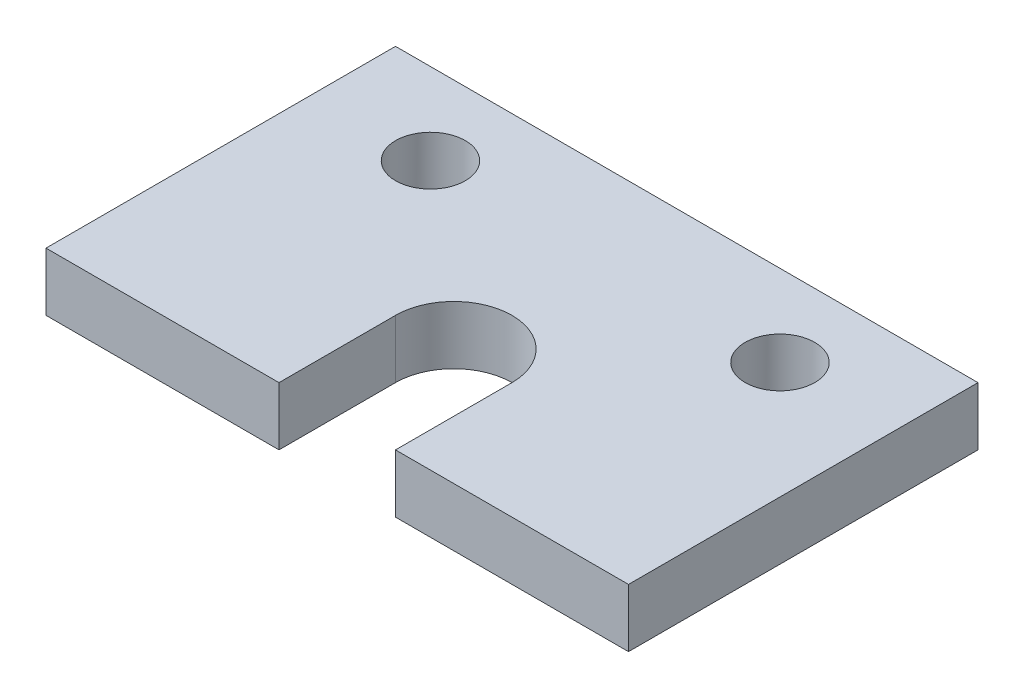
ISO-10303-21;
HEADER;
FILE_DESCRIPTION(('STEP AP214'),'2;1');
FILE_NAME('part.step','',(''),(''),'','','');
FILE_SCHEMA(('AUTOMOTIVE_DESIGN { 1 0 10303 214 1 1 1 1 }'));
ENDSEC;
DATA;
#1=APPLICATION_CONTEXT('core data for automotive mechanical design processes');
#2=APPLICATION_PROTOCOL_DEFINITION('international standard','automotive_design',2000,#1);
#3=PRODUCT_CONTEXT('',#1,'mechanical');
#4=PRODUCT('Part','Part','',(#3));
#5=PRODUCT_RELATED_PRODUCT_CATEGORY('part','',(#4));
#6=PRODUCT_DEFINITION_FORMATION('','',#4);
#7=PRODUCT_DEFINITION_CONTEXT('part definition',#1,'design');
#8=PRODUCT_DEFINITION('design','',#6,#7);
#9=PRODUCT_DEFINITION_SHAPE('','',#8);
#10=(LENGTH_UNIT() NAMED_UNIT(*) SI_UNIT(.MILLI.,.METRE.));
#11=(NAMED_UNIT(*) PLANE_ANGLE_UNIT() SI_UNIT($,.RADIAN.));
#12=(NAMED_UNIT(*) SI_UNIT($,.STERADIAN.) SOLID_ANGLE_UNIT());
#13=UNCERTAINTY_MEASURE_WITH_UNIT(LENGTH_MEASURE(1.E-05),#10,'distance_accuracy_value','');
#14=(GEOMETRIC_REPRESENTATION_CONTEXT(3) GLOBAL_UNCERTAINTY_ASSIGNED_CONTEXT((#13)) GLOBAL_UNIT_ASSIGNED_CONTEXT((#10,
#11,#12)) REPRESENTATION_CONTEXT('',''));
#15=CARTESIAN_POINT('',(0.,0.,0.));
#16=DIRECTION('',(0.,0.,1.));
#17=DIRECTION('',(1.,0.,0.));
#18=AXIS2_PLACEMENT_3D('',#15,#16,#17);
#19=CARTESIAN_POINT('',(-15.875,3.175,9.52500000000001));
#20=DIRECTION('',(0.,0.,-0.999999999999999));
#21=DIRECTION('',(-0.999999999999999,0.,0.));
#22=AXIS2_PLACEMENT_3D('',#19,#20,#21);
#23=PLANE('',#22);
#24=DIRECTION('',(0.999999999999999,0.,0.));
#25=VECTOR('',#24,1.);
#26=CARTESIAN_POINT('',(-15.875,3.175,9.52500000000001));
#27=LINE('',#26,#25);
#28=CARTESIAN_POINT('',(3.17499999999999,3.175,9.52499999999995));
#29=VERTEX_POINT('',#28);
#30=CARTESIAN_POINT('',(15.875,3.175,9.52500000000001));
#31=VERTEX_POINT('',#30);
#32=EDGE_CURVE('E66',#29,#31,#27,.T.);
#33=ORIENTED_EDGE('',*,*,#32,.F.);
#34=DIRECTION('',(0.,1.,0.));
#35=VECTOR('',#34,1.);
#36=CARTESIAN_POINT('',(3.17499999999999,0.,9.52499999999995));
#37=LINE('',#36,#35);
#38=CARTESIAN_POINT('',(3.17499999999999,0.,9.52499999999995));
#39=VERTEX_POINT('',#38);
#40=EDGE_CURVE('E158',#39,#29,#37,.T.);
#41=ORIENTED_EDGE('',*,*,#40,.F.);
#42=DIRECTION('',(0.999999999999999,0.,0.));
#43=VECTOR('',#42,1.);
#44=CARTESIAN_POINT('',(-15.875,0.,9.52500000000001));
#45=LINE('',#44,#43);
#46=CARTESIAN_POINT('',(15.875,0.,9.52500000000001));
#47=VERTEX_POINT('',#46);
#48=EDGE_CURVE('E88',#39,#47,#45,.T.);
#49=ORIENTED_EDGE('',*,*,#48,.T.);
#50=DIRECTION('',(0.,-1.,0.));
#51=VECTOR('',#50,1.);
#52=CARTESIAN_POINT('',(15.875,3.175,9.52500000000001));
#53=LINE('',#52,#51);
#54=EDGE_CURVE('E176',#31,#47,#53,.T.);
#55=ORIENTED_EDGE('',*,*,#54,.F.);
#56=EDGE_LOOP('',(#33,#41,#49,#55));
#57=FACE_BOUND('',#56,.T.);
#58=ADVANCED_FACE('F41',(#57),#23,.F.);
#59=CARTESIAN_POINT('',(15.875,3.175,9.52500000000001));
#60=DIRECTION('',(-0.999999999999999,0.,0.));
#61=DIRECTION('',(0.,0.,0.999999999999999));
#62=AXIS2_PLACEMENT_3D('',#59,#60,#61);
#63=PLANE('',#62);
#64=DIRECTION('',(0.,0.,-0.999999999999999));
#65=VECTOR('',#64,1.);
#66=CARTESIAN_POINT('',(15.875,0.,9.52500000000001));
#67=LINE('',#66,#65);
#68=CARTESIAN_POINT('',(15.875,0.,-9.52500000000001));
#69=VERTEX_POINT('',#68);
#70=EDGE_CURVE('E157',#47,#69,#67,.T.);
#71=ORIENTED_EDGE('',*,*,#70,.T.);
#72=DIRECTION('',(0.,-1.,0.));
#73=VECTOR('',#72,1.);
#74=CARTESIAN_POINT('',(15.875,3.175,-9.52500000000001));
#75=LINE('',#74,#73);
#76=CARTESIAN_POINT('',(15.875,3.175,-9.52500000000001));
#77=VERTEX_POINT('',#76);
#78=EDGE_CURVE('E11',#77,#69,#75,.T.);
#79=ORIENTED_EDGE('',*,*,#78,.F.);
#80=DIRECTION('',(0.,0.,-0.999999999999999));
#81=VECTOR('',#80,1.);
#82=CARTESIAN_POINT('',(15.875,3.175,9.52500000000001));
#83=LINE('',#82,#81);
#84=EDGE_CURVE('E163',#31,#77,#83,.T.);
#85=ORIENTED_EDGE('',*,*,#84,.F.);
#86=ORIENTED_EDGE('',*,*,#54,.T.);
#87=EDGE_LOOP('',(#71,#79,#85,#86));
#88=FACE_BOUND('',#87,.T.);
#89=ADVANCED_FACE('F43',(#88),#63,.F.);
#90=CARTESIAN_POINT('',(-15.875,3.175,-9.52500000000001));
#91=DIRECTION('',(0.,0.,0.999999999999999));
#92=DIRECTION('',(0.999999999999999,0.,0.));
#93=AXIS2_PLACEMENT_3D('',#90,#91,#92);
#94=PLANE('',#93);
#95=DIRECTION('',(-0.999999999999999,0.,0.));
#96=VECTOR('',#95,1.);
#97=CARTESIAN_POINT('',(-15.875,0.,-9.52500000000001));
#98=LINE('',#97,#96);
#99=CARTESIAN_POINT('',(-15.875,0.,-9.52500000000001));
#100=VERTEX_POINT('',#99);
#101=EDGE_CURVE('E180',#69,#100,#98,.T.);
#102=ORIENTED_EDGE('',*,*,#101,.T.);
#103=DIRECTION('',(0.,-1.,0.));
#104=VECTOR('',#103,1.);
#105=CARTESIAN_POINT('',(-15.875,3.175,-9.52500000000001));
#106=LINE('',#105,#104);
#107=CARTESIAN_POINT('',(-15.875,3.175,-9.52500000000001));
#108=VERTEX_POINT('',#107);
#109=EDGE_CURVE('E50',#108,#100,#106,.T.);
#110=ORIENTED_EDGE('',*,*,#109,.F.);
#111=DIRECTION('',(-0.999999999999999,0.,0.));
#112=VECTOR('',#111,1.);
#113=CARTESIAN_POINT('',(-15.875,3.175,-9.52500000000001));
#114=LINE('',#113,#112);
#115=EDGE_CURVE('E95',#77,#108,#114,.T.);
#116=ORIENTED_EDGE('',*,*,#115,.F.);
#117=ORIENTED_EDGE('',*,*,#78,.T.);
#118=EDGE_LOOP('',(#102,#110,#116,#117));
#119=FACE_BOUND('',#118,.T.);
#120=ADVANCED_FACE('F208',(#119),#94,.F.);
#121=CARTESIAN_POINT('',(-15.875,3.175,9.52500000000001));
#122=DIRECTION('',(0.999999999999999,0.,0.));
#123=DIRECTION('',(0.,0.,-0.999999999999999));
#124=AXIS2_PLACEMENT_3D('',#121,#122,#123);
#125=PLANE('',#124);
#126=DIRECTION('',(0.,0.,0.999999999999999));
#127=VECTOR('',#126,1.);
#128=CARTESIAN_POINT('',(-15.875,0.,9.52500000000001));
#129=LINE('',#128,#127);
#130=CARTESIAN_POINT('',(-15.875,0.,9.52500000000001));
#131=VERTEX_POINT('',#130);
#132=EDGE_CURVE('E183',#100,#131,#129,.T.);
#133=ORIENTED_EDGE('',*,*,#132,.T.);
#134=DIRECTION('',(0.,-1.,0.));
#135=VECTOR('',#134,1.);
#136=CARTESIAN_POINT('',(-15.875,3.175,9.52500000000001));
#137=LINE('',#136,#135);
#138=CARTESIAN_POINT('',(-15.875,3.175,9.52500000000001));
#139=VERTEX_POINT('',#138);
#140=EDGE_CURVE('E190',#139,#131,#137,.T.);
#141=ORIENTED_EDGE('',*,*,#140,.F.);
#142=DIRECTION('',(0.,0.,0.999999999999999));
#143=VECTOR('',#142,1.);
#144=CARTESIAN_POINT('',(-15.875,3.175,9.52500000000001));
#145=LINE('',#144,#143);
#146=EDGE_CURVE('E169',#108,#139,#145,.T.);
#147=ORIENTED_EDGE('',*,*,#146,.F.);
#148=ORIENTED_EDGE('',*,*,#109,.T.);
#149=EDGE_LOOP('',(#133,#141,#147,#148));
#150=FACE_BOUND('',#149,.T.);
#151=ADVANCED_FACE('F198',(#150),#125,.F.);
#152=CARTESIAN_POINT('',(-3.175,0.,9.52500000000001));
#153=VERTEX_POINT('',#152);
#154=EDGE_CURVE('E166',#131,#153,#45,.T.);
#155=ORIENTED_EDGE('',*,*,#154,.T.);
#156=DIRECTION('',(0.,1.,0.));
#157=VECTOR('',#156,1.);
#158=CARTESIAN_POINT('',(-3.175,0.,9.52500000000001));
#159=LINE('',#158,#157);
#160=CARTESIAN_POINT('',(-3.175,3.175,9.52500000000001));
#161=VERTEX_POINT('',#160);
#162=EDGE_CURVE('E57',#153,#161,#159,.T.);
#163=ORIENTED_EDGE('',*,*,#162,.T.);
#164=EDGE_CURVE('E172',#139,#161,#27,.T.);
#165=ORIENTED_EDGE('',*,*,#164,.F.);
#166=ORIENTED_EDGE('',*,*,#140,.T.);
#167=EDGE_LOOP('',(#155,#163,#165,#166));
#168=FACE_BOUND('',#167,.T.);
#169=ADVANCED_FACE('F202',(#168),#23,.F.);
#170=CARTESIAN_POINT('',(0.,3.175,0.));
#171=DIRECTION('',(0.,-1.,0.));
#172=DIRECTION('',(0.,0.,-0.999999999999999));
#173=AXIS2_PLACEMENT_3D('',#170,#171,#172);
#174=PLANE('',#173);
#175=CARTESIAN_POINT('',(-9.52499999999999,3.175,-5.08));
#176=DIRECTION('',(0.,1.,0.));
#177=DIRECTION('',(0.,0.,0.999999999999999));
#178=AXIS2_PLACEMENT_3D('',#175,#176,#177);
#179=CIRCLE('',#178,1.89865);
#180=CARTESIAN_POINT('',(-9.52499999999999,3.175,-3.18135));
#181=VERTEX_POINT('',#180);
#182=EDGE_CURVE('E252',#181,#181,#179,.T.);
#183=ORIENTED_EDGE('',*,*,#182,.F.);
#184=EDGE_LOOP('',(#183));
#185=FACE_BOUND('',#184,.T.);
#186=CARTESIAN_POINT('',(9.52499999999999,3.175,-5.08));
#187=DIRECTION('',(0.,1.,0.));
#188=DIRECTION('',(0.,0.,0.999999999999999));
#189=AXIS2_PLACEMENT_3D('',#186,#187,#188);
#190=CIRCLE('',#189,1.89865);
#191=CARTESIAN_POINT('',(9.52499999999999,3.175,-3.18135));
#192=VERTEX_POINT('',#191);
#193=EDGE_CURVE('E257',#192,#192,#190,.T.);
#194=ORIENTED_EDGE('',*,*,#193,.F.);
#195=EDGE_LOOP('',(#194));
#196=FACE_BOUND('',#195,.T.);
#197=CARTESIAN_POINT('',(0.,3.175,3.17500000000001));
#198=DIRECTION('',(0.,1.,0.));
#199=DIRECTION('',(0.,0.,0.999999999999999));
#200=AXIS2_PLACEMENT_3D('',#197,#198,#199);
#201=CIRCLE('',#200,3.175);
#202=CARTESIAN_POINT('',(3.17499999999999,3.175,3.17499999999998));
#203=VERTEX_POINT('',#202);
#204=CARTESIAN_POINT('',(-3.175,3.175,3.17500000000001));
#205=VERTEX_POINT('',#204);
#206=EDGE_CURVE('E124',#203,#205,#201,.T.);
#207=ORIENTED_EDGE('',*,*,#206,.F.);
#208=DIRECTION('',(0.,0.,-0.999999999999999));
#209=VECTOR('',#208,1.);
#210=CARTESIAN_POINT('',(3.17499999999999,3.175,9.52499999999995));
#211=LINE('',#210,#209);
#212=EDGE_CURVE('E138',#29,#203,#211,.T.);
#213=ORIENTED_EDGE('',*,*,#212,.F.);
#214=ORIENTED_EDGE('',*,*,#32,.T.);
#215=ORIENTED_EDGE('',*,*,#84,.T.);
#216=ORIENTED_EDGE('',*,*,#115,.T.);
#217=ORIENTED_EDGE('',*,*,#146,.T.);
#218=ORIENTED_EDGE('',*,*,#164,.T.);
#219=DIRECTION('',(0.,0.,0.999999999999999));
#220=VECTOR('',#219,1.);
#221=CARTESIAN_POINT('',(-3.175,3.175,3.17500000000001));
#222=LINE('',#221,#220);
#223=EDGE_CURVE('E142',#205,#161,#222,.T.);
#224=ORIENTED_EDGE('',*,*,#223,.F.);
#225=EDGE_LOOP('',(#207,#213,#214,#215,#216,#217,#218,#224));
#226=FACE_BOUND('',#225,.T.);
#227=ADVANCED_FACE('F204',(#185,#196,#226),#174,.F.);
#228=CARTESIAN_POINT('',(0.,0.,0.));
#229=DIRECTION('',(0.,-1.,0.));
#230=DIRECTION('',(0.,0.,-0.999999999999999));
#231=AXIS2_PLACEMENT_3D('',#228,#229,#230);
#232=PLANE('',#231);
#233=CARTESIAN_POINT('',(-9.52499999999999,0.,-5.08));
#234=DIRECTION('',(0.,-1.,0.));
#235=DIRECTION('',(0.,0.,-0.999999999999999));
#236=AXIS2_PLACEMENT_3D('',#233,#234,#235);
#237=CIRCLE('',#236,1.89865);
#238=CARTESIAN_POINT('',(-9.52499999999999,0.,-6.97865));
#239=VERTEX_POINT('',#238);
#240=EDGE_CURVE('E255',#239,#239,#237,.T.);
#241=ORIENTED_EDGE('',*,*,#240,.F.);
#242=EDGE_LOOP('',(#241));
#243=FACE_BOUND('',#242,.T.);
#244=CARTESIAN_POINT('',(9.52499999999999,0.,-5.08));
#245=DIRECTION('',(0.,-1.,0.));
#246=DIRECTION('',(0.,0.,-0.999999999999999));
#247=AXIS2_PLACEMENT_3D('',#244,#245,#246);
#248=CIRCLE('',#247,1.89865);
#249=CARTESIAN_POINT('',(9.52499999999999,0.,-6.97865));
#250=VERTEX_POINT('',#249);
#251=EDGE_CURVE('E145',#250,#250,#248,.T.);
#252=ORIENTED_EDGE('',*,*,#251,.F.);
#253=EDGE_LOOP('',(#252));
#254=FACE_BOUND('',#253,.T.);
#255=DIRECTION('',(0.,0.,-0.999999999999999));
#256=VECTOR('',#255,1.);
#257=CARTESIAN_POINT('',(3.17499999999999,0.,9.52499999999995));
#258=LINE('',#257,#256);
#259=CARTESIAN_POINT('',(3.17499999999999,0.,3.17499999999998));
#260=VERTEX_POINT('',#259);
#261=EDGE_CURVE('E127',#39,#260,#258,.T.);
#262=ORIENTED_EDGE('',*,*,#261,.T.);
#263=CARTESIAN_POINT('',(0.,0.,3.17500000000001));
#264=DIRECTION('',(0.,1.,0.));
#265=DIRECTION('',(0.,0.,0.999999999999999));
#266=AXIS2_PLACEMENT_3D('',#263,#264,#265);
#267=CIRCLE('',#266,3.175);
#268=CARTESIAN_POINT('',(-3.175,0.,3.17500000000001));
#269=VERTEX_POINT('',#268);
#270=EDGE_CURVE('E121',#260,#269,#267,.T.);
#271=ORIENTED_EDGE('',*,*,#270,.T.);
#272=DIRECTION('',(0.,0.,0.999999999999999));
#273=VECTOR('',#272,1.);
#274=CARTESIAN_POINT('',(-3.175,0.,3.17500000000001));
#275=LINE('',#274,#273);
#276=EDGE_CURVE('E129',#269,#153,#275,.T.);
#277=ORIENTED_EDGE('',*,*,#276,.T.);
#278=ORIENTED_EDGE('',*,*,#154,.F.);
#279=ORIENTED_EDGE('',*,*,#132,.F.);
#280=ORIENTED_EDGE('',*,*,#101,.F.);
#281=ORIENTED_EDGE('',*,*,#70,.F.);
#282=ORIENTED_EDGE('',*,*,#48,.F.);
#283=EDGE_LOOP('',(#262,#271,#277,#278,#279,#280,#281,#282));
#284=FACE_BOUND('',#283,.T.);
#285=ADVANCED_FACE('F136',(#243,#254,#284),#232,.T.);
#286=CARTESIAN_POINT('',(0.,0.,3.17500000000001));
#287=DIRECTION('',(0.,1.,0.));
#288=DIRECTION('',(0.,0.,0.999999999999999));
#289=AXIS2_PLACEMENT_3D('',#286,#287,#288);
#290=CYLINDRICAL_SURFACE('',#289,3.175);
#291=ORIENTED_EDGE('',*,*,#206,.T.);
#292=DIRECTION('',(0.,1.,0.));
#293=VECTOR('',#292,1.);
#294=CARTESIAN_POINT('',(-3.175,0.,3.17500000000001));
#295=LINE('',#294,#293);
#296=EDGE_CURVE('E118',#269,#205,#295,.T.);
#297=ORIENTED_EDGE('',*,*,#296,.F.);
#298=ORIENTED_EDGE('',*,*,#270,.F.);
#299=DIRECTION('',(0.,1.,0.));
#300=VECTOR('',#299,1.);
#301=CARTESIAN_POINT('',(3.17499999999999,0.,3.17499999999998));
#302=LINE('',#301,#300);
#303=EDGE_CURVE('E154',#260,#203,#302,.T.);
#304=ORIENTED_EDGE('',*,*,#303,.T.);
#305=EDGE_LOOP('',(#291,#297,#298,#304));
#306=FACE_BOUND('',#305,.T.);
#307=ADVANCED_FACE('F119',(#306),#290,.F.);
#308=CARTESIAN_POINT('',(3.17499999999999,0.,9.52499999999995));
#309=DIRECTION('',(0.999999999999999,0.,0.));
#310=DIRECTION('',(0.,0.,-0.999999999999999));
#311=AXIS2_PLACEMENT_3D('',#308,#309,#310);
#312=PLANE('',#311);
#313=ORIENTED_EDGE('',*,*,#212,.T.);
#314=ORIENTED_EDGE('',*,*,#303,.F.);
#315=ORIENTED_EDGE('',*,*,#261,.F.);
#316=ORIENTED_EDGE('',*,*,#40,.T.);
#317=EDGE_LOOP('',(#313,#314,#315,#316));
#318=FACE_BOUND('',#317,.T.);
#319=ADVANCED_FACE('F235',(#318),#312,.F.);
#320=CARTESIAN_POINT('',(-3.175,0.,3.17500000000001));
#321=DIRECTION('',(-0.999999999999999,0.,0.));
#322=DIRECTION('',(0.,0.,0.999999999999999));
#323=AXIS2_PLACEMENT_3D('',#320,#321,#322);
#324=PLANE('',#323);
#325=ORIENTED_EDGE('',*,*,#223,.T.);
#326=ORIENTED_EDGE('',*,*,#162,.F.);
#327=ORIENTED_EDGE('',*,*,#276,.F.);
#328=ORIENTED_EDGE('',*,*,#296,.T.);
#329=EDGE_LOOP('',(#325,#326,#327,#328));
#330=FACE_BOUND('',#329,.T.);
#331=ADVANCED_FACE('F130',(#330),#324,.F.);
#332=CARTESIAN_POINT('',(9.52499999999999,3.175,-5.08));
#333=DIRECTION('',(0.,1.,0.));
#334=DIRECTION('',(0.,0.,0.999999999999999));
#335=AXIS2_PLACEMENT_3D('',#332,#333,#334);
#336=CYLINDRICAL_SURFACE('',#335,1.89865);
#337=ORIENTED_EDGE('',*,*,#193,.T.);
#338=EDGE_LOOP('',(#337));
#339=FACE_BOUND('',#338,.T.);
#340=ORIENTED_EDGE('',*,*,#251,.T.);
#341=EDGE_LOOP('',(#340));
#342=FACE_BOUND('',#341,.T.);
#343=ADVANCED_FACE('F238',(#339,#342),#336,.F.);
#344=CARTESIAN_POINT('',(-9.52499999999999,3.175,-5.08));
#345=DIRECTION('',(0.,1.,0.));
#346=DIRECTION('',(0.,0.,0.999999999999999));
#347=AXIS2_PLACEMENT_3D('',#344,#345,#346);
#348=CYLINDRICAL_SURFACE('',#347,1.89865);
#349=ORIENTED_EDGE('',*,*,#182,.T.);
#350=EDGE_LOOP('',(#349));
#351=FACE_BOUND('',#350,.T.);
#352=ORIENTED_EDGE('',*,*,#240,.T.);
#353=EDGE_LOOP('',(#352));
#354=FACE_BOUND('',#353,.T.);
#355=ADVANCED_FACE('F244',(#351,#354),#348,.F.);
#356=CLOSED_SHELL('',(#58,#89,#120,#151,#169,#227,#285,#307,#319,#331,#343,#355));
#357=MANIFOLD_SOLID_BREP('B2',#356);
#358=ADVANCED_BREP_SHAPE_REPRESENTATION('',(#18,#357),#14);
#359=SHAPE_DEFINITION_REPRESENTATION(#9,#358);
ENDSEC;
END-ISO-10303-21;
